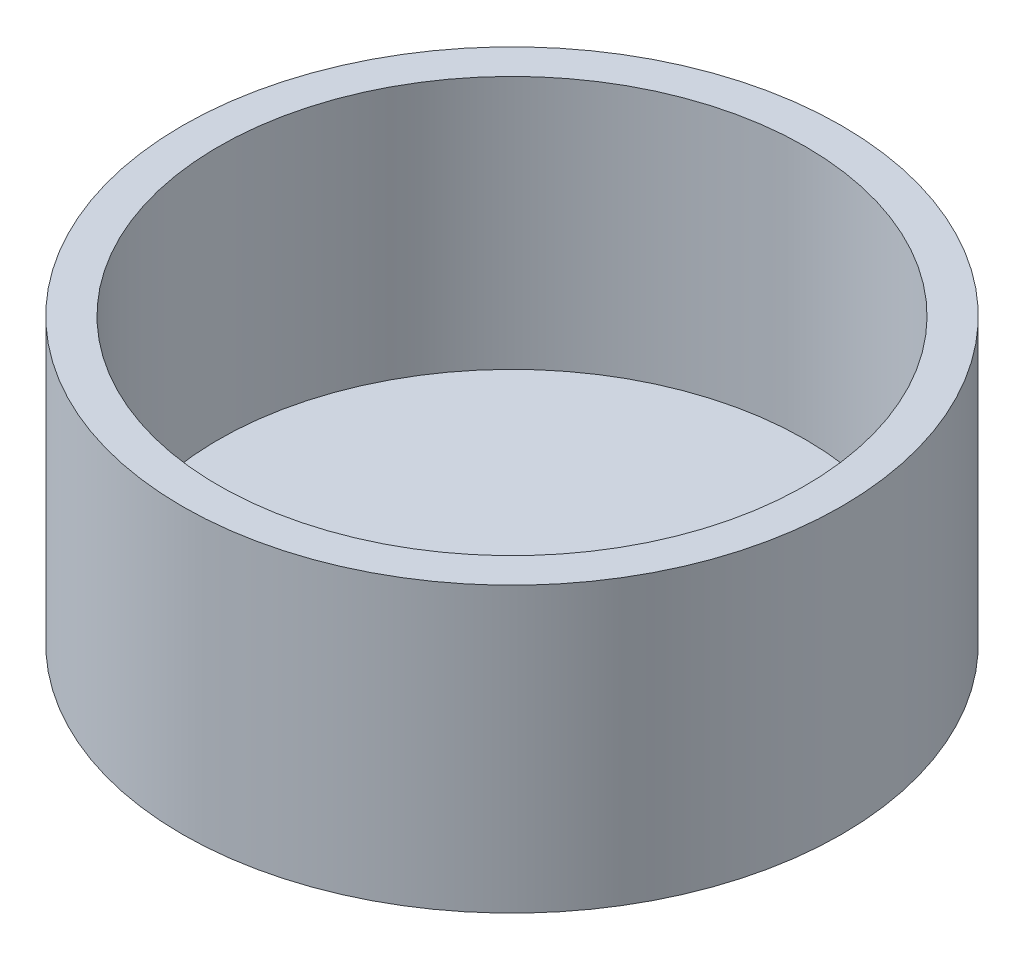
ISO-10303-21;
HEADER;
FILE_DESCRIPTION(('STEP AP214'),'2;1');
FILE_NAME('part.step','',(''),(''),'','','');
FILE_SCHEMA(('AUTOMOTIVE_DESIGN { 1 0 10303 214 1 1 1 1 }'));
ENDSEC;
DATA;
#1=APPLICATION_CONTEXT('core data for automotive mechanical design processes');
#2=APPLICATION_PROTOCOL_DEFINITION('international standard','automotive_design',2000,#1);
#3=PRODUCT_CONTEXT('',#1,'mechanical');
#4=PRODUCT('Part','Part','',(#3));
#5=PRODUCT_RELATED_PRODUCT_CATEGORY('part','',(#4));
#6=PRODUCT_DEFINITION_FORMATION('','',#4);
#7=PRODUCT_DEFINITION_CONTEXT('part definition',#1,'design');
#8=PRODUCT_DEFINITION('design','',#6,#7);
#9=PRODUCT_DEFINITION_SHAPE('','',#8);
#10=(LENGTH_UNIT() NAMED_UNIT(*) SI_UNIT(.MILLI.,.METRE.));
#11=(NAMED_UNIT(*) PLANE_ANGLE_UNIT() SI_UNIT($,.RADIAN.));
#12=(NAMED_UNIT(*) SI_UNIT($,.STERADIAN.) SOLID_ANGLE_UNIT());
#13=UNCERTAINTY_MEASURE_WITH_UNIT(LENGTH_MEASURE(1.E-05),#10,'distance_accuracy_value','');
#14=(GEOMETRIC_REPRESENTATION_CONTEXT(3) GLOBAL_UNCERTAINTY_ASSIGNED_CONTEXT((#13)) GLOBAL_UNIT_ASSIGNED_CONTEXT((#10,
#11,#12)) REPRESENTATION_CONTEXT('',''));
#15=CARTESIAN_POINT('',(0.,0.,0.));
#16=DIRECTION('',(0.,0.,1.));
#17=DIRECTION('',(1.,0.,0.));
#18=AXIS2_PLACEMENT_3D('',#15,#16,#17);
#19=CARTESIAN_POINT('',(64.2,0.,0.));
#20=DIRECTION('',(0.,-1.,0.));
#21=DIRECTION('',(0.,0.,-1.));
#22=AXIS2_PLACEMENT_3D('',#19,#20,#21);
#23=PLANE('',#22);
#24=CARTESIAN_POINT('',(0.,0.,0.));
#25=DIRECTION('',(0.,-1.,0.));
#26=DIRECTION('',(0.,0.,-1.));
#27=AXIS2_PLACEMENT_3D('',#24,#25,#26);
#28=CIRCLE('',#27,64.2);
#29=CARTESIAN_POINT('',(0.,0.,-64.2));
#30=VERTEX_POINT('',#29);
#31=EDGE_CURVE('E45',#30,#30,#28,.T.);
#32=ORIENTED_EDGE('',*,*,#31,.T.);
#33=EDGE_LOOP('',(#32));
#34=FACE_BOUND('',#33,.T.);
#35=ADVANCED_FACE('F31',(#34),#23,.T.);
#36=CARTESIAN_POINT('',(0.,5.89999999999998,0.));
#37=DIRECTION('',(0.,1.,0.));
#38=DIRECTION('',(0.,0.,1.));
#39=AXIS2_PLACEMENT_3D('',#36,#37,#38);
#40=PLANE('',#39);
#41=CARTESIAN_POINT('',(0.,5.89999999999998,0.));
#42=DIRECTION('',(0.,-1.,0.));
#43=DIRECTION('',(0.,0.,-1.));
#44=AXIS2_PLACEMENT_3D('',#41,#42,#43);
#45=CIRCLE('',#44,57.15);
#46=CARTESIAN_POINT('',(0.,5.89999999999998,-57.15));
#47=VERTEX_POINT('',#46);
#48=EDGE_CURVE('E10',#47,#47,#45,.T.);
#49=ORIENTED_EDGE('',*,*,#48,.F.);
#50=EDGE_LOOP('',(#49));
#51=FACE_BOUND('',#50,.T.);
#52=ADVANCED_FACE('F63',(#51),#40,.T.);
#53=CARTESIAN_POINT('',(0.,0.,0.));
#54=DIRECTION('',(0.,-1.,0.));
#55=DIRECTION('',(0.,0.,-1.));
#56=AXIS2_PLACEMENT_3D('',#53,#54,#55);
#57=CYLINDRICAL_SURFACE('',#56,57.15);
#58=ORIENTED_EDGE('',*,*,#48,.T.);
#59=EDGE_LOOP('',(#58));
#60=FACE_BOUND('',#59,.T.);
#61=CARTESIAN_POINT('',(0.,55.3,0.));
#62=DIRECTION('',(0.,-1.,0.));
#63=DIRECTION('',(0.,0.,-1.));
#64=AXIS2_PLACEMENT_3D('',#61,#62,#63);
#65=CIRCLE('',#64,57.15);
#66=CARTESIAN_POINT('',(0.,55.3,-57.15));
#67=VERTEX_POINT('',#66);
#68=EDGE_CURVE('E37',#67,#67,#65,.T.);
#69=ORIENTED_EDGE('',*,*,#68,.F.);
#70=EDGE_LOOP('',(#69));
#71=FACE_BOUND('',#70,.T.);
#72=ADVANCED_FACE('F60',(#60,#71),#57,.F.);
#73=CARTESIAN_POINT('',(57.15,55.3,0.));
#74=DIRECTION('',(0.,1.,0.));
#75=DIRECTION('',(0.,0.,1.));
#76=AXIS2_PLACEMENT_3D('',#73,#74,#75);
#77=PLANE('',#76);
#78=ORIENTED_EDGE('',*,*,#68,.T.);
#79=EDGE_LOOP('',(#78));
#80=FACE_BOUND('',#79,.T.);
#81=CARTESIAN_POINT('',(0.,55.3,0.));
#82=DIRECTION('',(0.,-1.,0.));
#83=DIRECTION('',(0.,0.,-1.));
#84=AXIS2_PLACEMENT_3D('',#81,#82,#83);
#85=CIRCLE('',#84,64.2);
#86=CARTESIAN_POINT('',(0.,55.3,-64.2));
#87=VERTEX_POINT('',#86);
#88=EDGE_CURVE('E41',#87,#87,#85,.T.);
#89=ORIENTED_EDGE('',*,*,#88,.F.);
#90=EDGE_LOOP('',(#89));
#91=FACE_BOUND('',#90,.T.);
#92=ADVANCED_FACE('F54',(#80,#91),#77,.T.);
#93=CARTESIAN_POINT('',(0.,0.,0.));
#94=DIRECTION('',(0.,-1.,0.));
#95=DIRECTION('',(0.,0.,-1.));
#96=AXIS2_PLACEMENT_3D('',#93,#94,#95);
#97=CYLINDRICAL_SURFACE('',#96,64.2);
#98=ORIENTED_EDGE('',*,*,#88,.T.);
#99=EDGE_LOOP('',(#98));
#100=FACE_BOUND('',#99,.T.);
#101=ORIENTED_EDGE('',*,*,#31,.F.);
#102=EDGE_LOOP('',(#101));
#103=FACE_BOUND('',#102,.T.);
#104=ADVANCED_FACE('F52',(#100,#103),#97,.T.);
#105=CLOSED_SHELL('',(#35,#52,#72,#92,#104));
#106=MANIFOLD_SOLID_BREP('B2',#105);
#107=ADVANCED_BREP_SHAPE_REPRESENTATION('',(#18,#106),#14);
#108=SHAPE_DEFINITION_REPRESENTATION(#9,#107);
ENDSEC;
END-ISO-10303-21;
